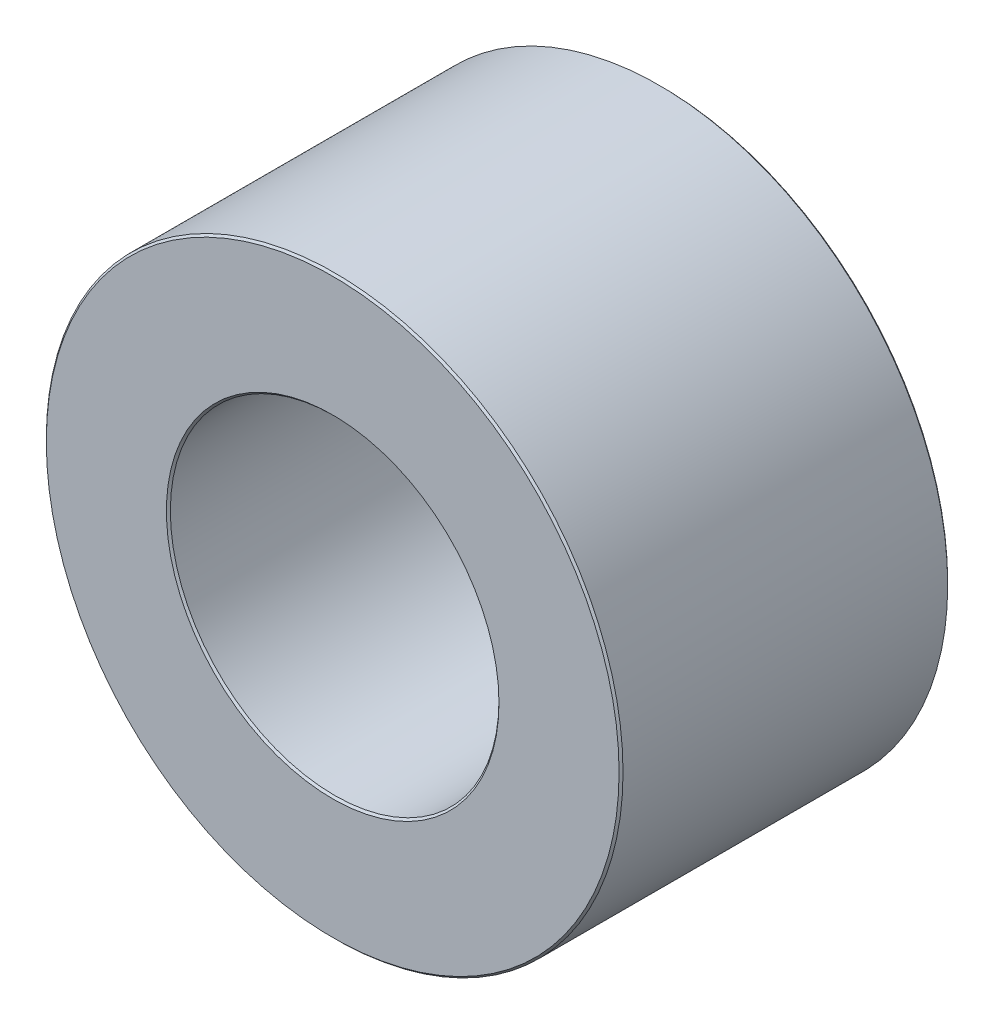
ISO-10303-21;
HEADER;
FILE_DESCRIPTION(('STEP AP214'),'2;1');
FILE_NAME('part.step','',(''),(''),'','','');
FILE_SCHEMA(('AUTOMOTIVE_DESIGN { 1 0 10303 214 1 1 1 1 }'));
ENDSEC;
DATA;
#1=APPLICATION_CONTEXT('core data for automotive mechanical design processes');
#2=APPLICATION_PROTOCOL_DEFINITION('international standard','automotive_design',2000,#1);
#3=PRODUCT_CONTEXT('',#1,'mechanical');
#4=PRODUCT('Part','Part','',(#3));
#5=PRODUCT_RELATED_PRODUCT_CATEGORY('part','',(#4));
#6=PRODUCT_DEFINITION_FORMATION('','',#4);
#7=PRODUCT_DEFINITION_CONTEXT('part definition',#1,'design');
#8=PRODUCT_DEFINITION('design','',#6,#7);
#9=PRODUCT_DEFINITION_SHAPE('','',#8);
#10=(LENGTH_UNIT() NAMED_UNIT(*) SI_UNIT(.MILLI.,.METRE.));
#11=(NAMED_UNIT(*) PLANE_ANGLE_UNIT() SI_UNIT($,.RADIAN.));
#12=(NAMED_UNIT(*) SI_UNIT($,.STERADIAN.) SOLID_ANGLE_UNIT());
#13=UNCERTAINTY_MEASURE_WITH_UNIT(LENGTH_MEASURE(1.E-05),#10,'distance_accuracy_value','');
#14=(GEOMETRIC_REPRESENTATION_CONTEXT(3) GLOBAL_UNCERTAINTY_ASSIGNED_CONTEXT((#13)) GLOBAL_UNIT_ASSIGNED_CONTEXT((#10,
#11,#12)) REPRESENTATION_CONTEXT('',''));
#15=CARTESIAN_POINT('',(0.,0.,0.));
#16=DIRECTION('',(0.,0.,1.));
#17=DIRECTION('',(1.,0.,0.));
#18=AXIS2_PLACEMENT_3D('',#15,#16,#17);
#19=CARTESIAN_POINT('',(0.,0.,1.99999999999999));
#20=DIRECTION('',(0.,0.,1.));
#21=DIRECTION('',(1.,0.,0.));
#22=AXIS2_PLACEMENT_3D('',#19,#20,#21);
#23=PLANE('',#22);
#24=CARTESIAN_POINT('',(0.,0.,1.99999999999999));
#25=DIRECTION('',(0.,0.,1.));
#26=DIRECTION('',(1.,0.,0.));
#27=AXIS2_PLACEMENT_3D('',#24,#25,#26);
#28=CIRCLE('',#27,2.024);
#29=CARTESIAN_POINT('',(2.024,0.,1.99999999999999));
#30=VERTEX_POINT('',#29);
#31=EDGE_CURVE('E10',#30,#30,#28,.F.);
#32=ORIENTED_EDGE('',*,*,#31,.T.);
#33=EDGE_LOOP('',(#32));
#34=FACE_BOUND('',#33,.T.);
#35=CARTESIAN_POINT('',(0.,0.,1.99999999999999));
#36=DIRECTION('',(0.,0.,1.));
#37=DIRECTION('',(1.,0.,0.));
#38=AXIS2_PLACEMENT_3D('',#35,#36,#37);
#39=CIRCLE('',#38,3.486);
#40=CARTESIAN_POINT('',(3.486,0.,1.99999999999999));
#41=VERTEX_POINT('',#40);
#42=EDGE_CURVE('E49',#41,#41,#39,.T.);
#43=ORIENTED_EDGE('',*,*,#42,.T.);
#44=EDGE_LOOP('',(#43));
#45=FACE_BOUND('',#44,.T.);
#46=ADVANCED_FACE('F41',(#34,#45),#23,.T.);
#47=CARTESIAN_POINT('',(0.,0.,1.99999999999999));
#48=DIRECTION('',(0.,0.,-1.));
#49=DIRECTION('',(-1.,0.,0.));
#50=AXIS2_PLACEMENT_3D('',#47,#48,#49);
#51=CYLINDRICAL_SURFACE('',#50,3.51);
#52=CARTESIAN_POINT('',(0.,0.,-1.976));
#53=DIRECTION('',(0.,0.,1.));
#54=DIRECTION('',(1.,0.,0.));
#55=AXIS2_PLACEMENT_3D('',#52,#53,#54);
#56=CIRCLE('',#55,3.51);
#57=CARTESIAN_POINT('',(3.51,0.,-1.976));
#58=VERTEX_POINT('',#57);
#59=EDGE_CURVE('E73',#58,#58,#56,.T.);
#60=ORIENTED_EDGE('',*,*,#59,.T.);
#61=EDGE_LOOP('',(#60));
#62=FACE_BOUND('',#61,.T.);
#63=CARTESIAN_POINT('',(0.,0.,1.976));
#64=DIRECTION('',(0.,0.,1.));
#65=DIRECTION('',(1.,0.,0.));
#66=AXIS2_PLACEMENT_3D('',#63,#64,#65);
#67=CIRCLE('',#66,3.51);
#68=CARTESIAN_POINT('',(3.51,0.,1.976));
#69=VERTEX_POINT('',#68);
#70=EDGE_CURVE('E77',#69,#69,#67,.F.);
#71=ORIENTED_EDGE('',*,*,#70,.T.);
#72=EDGE_LOOP('',(#71));
#73=FACE_BOUND('',#72,.T.);
#74=ADVANCED_FACE('F82',(#62,#73),#51,.T.);
#75=CARTESIAN_POINT('',(0.,0.,1.99999999999999));
#76=DIRECTION('',(0.,0.,-1.));
#77=DIRECTION('',(-1.,0.,0.));
#78=AXIS2_PLACEMENT_3D('',#75,#76,#77);
#79=CYLINDRICAL_SURFACE('',#78,2.);
#80=CARTESIAN_POINT('',(0.,0.,-1.97599999999999));
#81=DIRECTION('',(0.,0.,1.));
#82=DIRECTION('',(1.,0.,0.));
#83=AXIS2_PLACEMENT_3D('',#80,#81,#82);
#84=CIRCLE('',#83,2.);
#85=CARTESIAN_POINT('',(2.,0.,-1.97599999999999));
#86=VERTEX_POINT('',#85);
#87=EDGE_CURVE('E54',#86,#86,#84,.F.);
#88=ORIENTED_EDGE('',*,*,#87,.T.);
#89=EDGE_LOOP('',(#88));
#90=FACE_BOUND('',#89,.T.);
#91=CARTESIAN_POINT('',(0.,0.,1.97599999999999));
#92=DIRECTION('',(0.,0.,1.));
#93=DIRECTION('',(1.,0.,0.));
#94=AXIS2_PLACEMENT_3D('',#91,#92,#93);
#95=CIRCLE('',#94,2.);
#96=CARTESIAN_POINT('',(2.,0.,1.97599999999999));
#97=VERTEX_POINT('',#96);
#98=EDGE_CURVE('E59',#97,#97,#95,.T.);
#99=ORIENTED_EDGE('',*,*,#98,.T.);
#100=EDGE_LOOP('',(#99));
#101=FACE_BOUND('',#100,.T.);
#102=ADVANCED_FACE('F97',(#90,#101),#79,.F.);
#103=CARTESIAN_POINT('',(0.,0.,-1.99999999999999));
#104=DIRECTION('',(0.,0.,1.));
#105=DIRECTION('',(1.,0.,0.));
#106=AXIS2_PLACEMENT_3D('',#103,#104,#105);
#107=PLANE('',#106);
#108=CARTESIAN_POINT('',(0.,0.,-1.99999999999999));
#109=DIRECTION('',(0.,0.,1.));
#110=DIRECTION('',(1.,0.,0.));
#111=AXIS2_PLACEMENT_3D('',#108,#109,#110);
#112=CIRCLE('',#111,3.486);
#113=CARTESIAN_POINT('',(3.486,0.,-1.99999999999999));
#114=VERTEX_POINT('',#113);
#115=EDGE_CURVE('E65',#114,#114,#112,.F.);
#116=ORIENTED_EDGE('',*,*,#115,.T.);
#117=EDGE_LOOP('',(#116));
#118=FACE_BOUND('',#117,.T.);
#119=CARTESIAN_POINT('',(0.,0.,-1.99999999999999));
#120=DIRECTION('',(0.,0.,1.));
#121=DIRECTION('',(1.,0.,0.));
#122=AXIS2_PLACEMENT_3D('',#119,#120,#121);
#123=CIRCLE('',#122,2.024);
#124=CARTESIAN_POINT('',(2.024,0.,-1.99999999999999));
#125=VERTEX_POINT('',#124);
#126=EDGE_CURVE('E69',#125,#125,#123,.T.);
#127=ORIENTED_EDGE('',*,*,#126,.T.);
#128=EDGE_LOOP('',(#127));
#129=FACE_BOUND('',#128,.T.);
#130=ADVANCED_FACE('F106',(#118,#129),#107,.F.);
#131=CARTESIAN_POINT('',(0.,0.,-1.976));
#132=DIRECTION('',(0.,0.,1.));
#133=DIRECTION('',(1.,0.,0.));
#134=AXIS2_PLACEMENT_3D('',#131,#132,#133);
#135=CONICAL_SURFACE('',#134,3.51,0.785398163397457);
#136=ORIENTED_EDGE('',*,*,#115,.F.);
#137=EDGE_LOOP('',(#136));
#138=FACE_BOUND('',#137,.T.);
#139=ORIENTED_EDGE('',*,*,#59,.F.);
#140=EDGE_LOOP('',(#139));
#141=FACE_BOUND('',#140,.T.);
#142=ADVANCED_FACE('F103',(#138,#141),#135,.T.);
#143=CARTESIAN_POINT('',(0.,0.,-1.99999999999999));
#144=DIRECTION('',(0.,0.,-1.));
#145=DIRECTION('',(-1.,0.,0.));
#146=AXIS2_PLACEMENT_3D('',#143,#144,#145);
#147=CONICAL_SURFACE('',#146,2.024,0.785398163397448);
#148=ORIENTED_EDGE('',*,*,#87,.F.);
#149=EDGE_LOOP('',(#148));
#150=FACE_BOUND('',#149,.T.);
#151=ORIENTED_EDGE('',*,*,#126,.F.);
#152=EDGE_LOOP('',(#151));
#153=FACE_BOUND('',#152,.T.);
#154=ADVANCED_FACE('F90',(#150,#153),#147,.F.);
#155=CARTESIAN_POINT('',(0.,0.,1.97599999999999));
#156=DIRECTION('',(0.,0.,1.));
#157=DIRECTION('',(1.,0.,0.));
#158=AXIS2_PLACEMENT_3D('',#155,#156,#157);
#159=CONICAL_SURFACE('',#158,2.,0.785398163397412);
#160=ORIENTED_EDGE('',*,*,#31,.F.);
#161=EDGE_LOOP('',(#160));
#162=FACE_BOUND('',#161,.T.);
#163=ORIENTED_EDGE('',*,*,#98,.F.);
#164=EDGE_LOOP('',(#163));
#165=FACE_BOUND('',#164,.T.);
#166=ADVANCED_FACE('F86',(#162,#165),#159,.F.);
#167=CARTESIAN_POINT('',(0.,0.,1.99999999999999));
#168=DIRECTION('',(0.,0.,-1.));
#169=DIRECTION('',(-1.,0.,0.));
#170=AXIS2_PLACEMENT_3D('',#167,#168,#169);
#171=CONICAL_SURFACE('',#170,3.486,0.785398163397439);
#172=ORIENTED_EDGE('',*,*,#70,.F.);
#173=EDGE_LOOP('',(#172));
#174=FACE_BOUND('',#173,.T.);
#175=ORIENTED_EDGE('',*,*,#42,.F.);
#176=EDGE_LOOP('',(#175));
#177=FACE_BOUND('',#176,.T.);
#178=ADVANCED_FACE('F43',(#174,#177),#171,.T.);
#179=CLOSED_SHELL('',(#46,#74,#102,#130,#142,#154,#166,#178));
#180=MANIFOLD_SOLID_BREP('B2',#179);
#181=ADVANCED_BREP_SHAPE_REPRESENTATION('',(#18,#180),#14);
#182=SHAPE_DEFINITION_REPRESENTATION(#9,#181);
ENDSEC;
END-ISO-10303-21;
